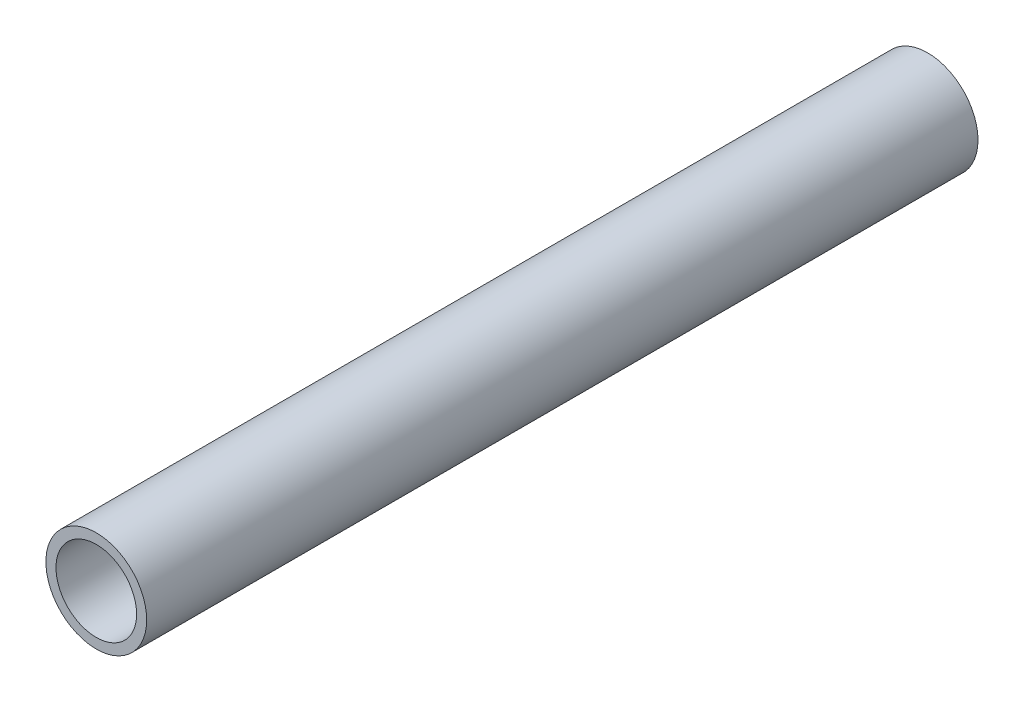
ISO-10303-21;
HEADER;
FILE_DESCRIPTION(('STEP AP214'),'2;1');
FILE_NAME('part.step','',(''),(''),'','','');
FILE_SCHEMA(('AUTOMOTIVE_DESIGN { 1 0 10303 214 1 1 1 1 }'));
ENDSEC;
DATA;
#1=APPLICATION_CONTEXT('core data for automotive mechanical design processes');
#2=APPLICATION_PROTOCOL_DEFINITION('international standard','automotive_design',2000,#1);
#3=PRODUCT_CONTEXT('',#1,'mechanical');
#4=PRODUCT('Part','Part','',(#3));
#5=PRODUCT_RELATED_PRODUCT_CATEGORY('part','',(#4));
#6=PRODUCT_DEFINITION_FORMATION('','',#4);
#7=PRODUCT_DEFINITION_CONTEXT('part definition',#1,'design');
#8=PRODUCT_DEFINITION('design','',#6,#7);
#9=PRODUCT_DEFINITION_SHAPE('','',#8);
#10=(LENGTH_UNIT() NAMED_UNIT(*) SI_UNIT(.MILLI.,.METRE.));
#11=(NAMED_UNIT(*) PLANE_ANGLE_UNIT() SI_UNIT($,.RADIAN.));
#12=(NAMED_UNIT(*) SI_UNIT($,.STERADIAN.) SOLID_ANGLE_UNIT());
#13=UNCERTAINTY_MEASURE_WITH_UNIT(LENGTH_MEASURE(1.E-05),#10,'distance_accuracy_value','');
#14=(GEOMETRIC_REPRESENTATION_CONTEXT(3) GLOBAL_UNCERTAINTY_ASSIGNED_CONTEXT((#13)) GLOBAL_UNIT_ASSIGNED_CONTEXT((#10,
#11,#12)) REPRESENTATION_CONTEXT('',''));
#15=CARTESIAN_POINT('',(0.,0.,0.));
#16=DIRECTION('',(0.,0.,1.));
#17=DIRECTION('',(1.,0.,0.));
#18=AXIS2_PLACEMENT_3D('',#15,#16,#17);
#19=CARTESIAN_POINT('',(0.,0.,165.));
#20=DIRECTION('',(0.,0.,1.));
#21=DIRECTION('',(1.,0.,0.));
#22=AXIS2_PLACEMENT_3D('',#19,#20,#21);
#23=PLANE('',#22);
#24=CARTESIAN_POINT('',(0.,0.,165.));
#25=DIRECTION('',(0.,0.,1.));
#26=DIRECTION('',(1.,0.,0.));
#27=AXIS2_PLACEMENT_3D('',#24,#25,#26);
#28=CIRCLE('',#27,10.);
#29=CARTESIAN_POINT('',(10.,0.,165.));
#30=VERTEX_POINT('',#29);
#31=EDGE_CURVE('E10',#30,#30,#28,.T.);
#32=ORIENTED_EDGE('',*,*,#31,.T.);
#33=EDGE_LOOP('',(#32));
#34=FACE_BOUND('',#33,.T.);
#35=CARTESIAN_POINT('',(0.,0.,165.));
#36=DIRECTION('',(0.,0.,1.));
#37=DIRECTION('',(1.,0.,0.));
#38=AXIS2_PLACEMENT_3D('',#35,#36,#37);
#39=CIRCLE('',#38,8.);
#40=CARTESIAN_POINT('',(8.,0.,165.));
#41=VERTEX_POINT('',#40);
#42=EDGE_CURVE('E48',#41,#41,#39,.T.);
#43=ORIENTED_EDGE('',*,*,#42,.F.);
#44=EDGE_LOOP('',(#43));
#45=FACE_BOUND('',#44,.T.);
#46=ADVANCED_FACE('F37',(#34,#45),#23,.T.);
#47=CARTESIAN_POINT('',(0.,0.,0.));
#48=DIRECTION('',(0.,0.,1.));
#49=DIRECTION('',(1.,0.,0.));
#50=AXIS2_PLACEMENT_3D('',#47,#48,#49);
#51=PLANE('',#50);
#52=CARTESIAN_POINT('',(0.,0.,0.));
#53=DIRECTION('',(0.,0.,1.));
#54=DIRECTION('',(1.,0.,0.));
#55=AXIS2_PLACEMENT_3D('',#52,#53,#54);
#56=CIRCLE('',#55,10.);
#57=CARTESIAN_POINT('',(10.,0.,0.));
#58=VERTEX_POINT('',#57);
#59=EDGE_CURVE('E41',#58,#58,#56,.T.);
#60=ORIENTED_EDGE('',*,*,#59,.F.);
#61=EDGE_LOOP('',(#60));
#62=FACE_BOUND('',#61,.T.);
#63=CARTESIAN_POINT('',(0.,0.,0.));
#64=DIRECTION('',(0.,0.,1.));
#65=DIRECTION('',(1.,0.,0.));
#66=AXIS2_PLACEMENT_3D('',#63,#64,#65);
#67=CIRCLE('',#66,8.);
#68=CARTESIAN_POINT('',(8.,0.,0.));
#69=VERTEX_POINT('',#68);
#70=EDGE_CURVE('E50',#69,#69,#67,.T.);
#71=ORIENTED_EDGE('',*,*,#70,.T.);
#72=EDGE_LOOP('',(#71));
#73=FACE_BOUND('',#72,.T.);
#74=ADVANCED_FACE('F60',(#62,#73),#51,.F.);
#75=CARTESIAN_POINT('',(0.,0.,165.));
#76=DIRECTION('',(0.,0.,-1.));
#77=DIRECTION('',(-1.,0.,0.));
#78=AXIS2_PLACEMENT_3D('',#75,#76,#77);
#79=CYLINDRICAL_SURFACE('',#78,10.);
#80=ORIENTED_EDGE('',*,*,#31,.F.);
#81=EDGE_LOOP('',(#80));
#82=FACE_BOUND('',#81,.T.);
#83=ORIENTED_EDGE('',*,*,#59,.T.);
#84=EDGE_LOOP('',(#83));
#85=FACE_BOUND('',#84,.T.);
#86=ADVANCED_FACE('F39',(#82,#85),#79,.T.);
#87=CARTESIAN_POINT('',(0.,0.,165.));
#88=DIRECTION('',(0.,0.,-1.));
#89=DIRECTION('',(-1.,0.,0.));
#90=AXIS2_PLACEMENT_3D('',#87,#88,#89);
#91=CYLINDRICAL_SURFACE('',#90,8.);
#92=ORIENTED_EDGE('',*,*,#42,.T.);
#93=EDGE_LOOP('',(#92));
#94=FACE_BOUND('',#93,.T.);
#95=ORIENTED_EDGE('',*,*,#70,.F.);
#96=EDGE_LOOP('',(#95));
#97=FACE_BOUND('',#96,.T.);
#98=ADVANCED_FACE('F56',(#94,#97),#91,.F.);
#99=CLOSED_SHELL('',(#46,#74,#86,#98));
#100=MANIFOLD_SOLID_BREP('B2',#99);
#101=ADVANCED_BREP_SHAPE_REPRESENTATION('',(#18,#100),#14);
#102=SHAPE_DEFINITION_REPRESENTATION(#9,#101);
ENDSEC;
END-ISO-10303-21;
